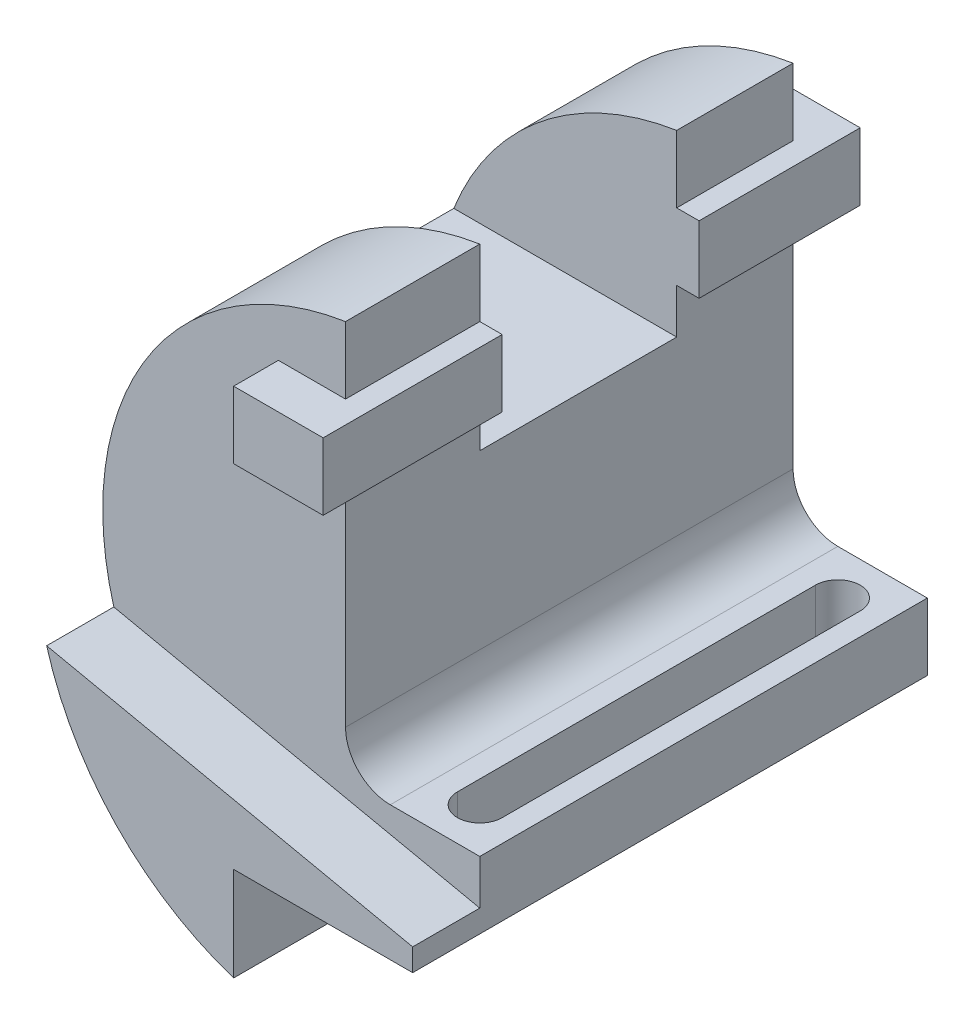
ISO-10303-21;
HEADER;
FILE_DESCRIPTION(('STEP AP214'),'2;1');
FILE_NAME('part.step','',(''),(''),'','','');
FILE_SCHEMA(('AUTOMOTIVE_DESIGN { 1 0 10303 214 1 1 1 1 }'));
ENDSEC;
DATA;
#1=APPLICATION_CONTEXT('core data for automotive mechanical design processes');
#2=APPLICATION_PROTOCOL_DEFINITION('international standard','automotive_design',2000,#1);
#3=PRODUCT_CONTEXT('',#1,'mechanical');
#4=PRODUCT('Part','Part','',(#3));
#5=PRODUCT_RELATED_PRODUCT_CATEGORY('part','',(#4));
#6=PRODUCT_DEFINITION_FORMATION('','',#4);
#7=PRODUCT_DEFINITION_CONTEXT('part definition',#1,'design');
#8=PRODUCT_DEFINITION('design','',#6,#7);
#9=PRODUCT_DEFINITION_SHAPE('','',#8);
#10=(LENGTH_UNIT() NAMED_UNIT(*) SI_UNIT(.MILLI.,.METRE.));
#11=(NAMED_UNIT(*) PLANE_ANGLE_UNIT() SI_UNIT($,.RADIAN.));
#12=(NAMED_UNIT(*) SI_UNIT($,.STERADIAN.) SOLID_ANGLE_UNIT());
#13=UNCERTAINTY_MEASURE_WITH_UNIT(LENGTH_MEASURE(1.E-05),#10,'distance_accuracy_value','');
#14=(GEOMETRIC_REPRESENTATION_CONTEXT(3) GLOBAL_UNCERTAINTY_ASSIGNED_CONTEXT((#13)) GLOBAL_UNIT_ASSIGNED_CONTEXT((#10,
#11,#12)) REPRESENTATION_CONTEXT('',''));
#15=CARTESIAN_POINT('',(0.,0.,0.));
#16=DIRECTION('',(0.,0.,1.));
#17=DIRECTION('',(1.,0.,0.));
#18=AXIS2_PLACEMENT_3D('',#15,#16,#17);
#19=CARTESIAN_POINT('',(-10.,63.4670189941201,115.));
#20=DIRECTION('',(-1.,0.,0.));
#21=DIRECTION('',(0.,-1.,0.));
#22=AXIS2_PLACEMENT_3D('',#19,#20,#21);
#23=PLANE('',#22);
#24=DIRECTION('',(0.,0.,-1.));
#25=VECTOR('',#24,1.);
#26=CARTESIAN_POINT('',(-10.,48.4670189941201,115.));
#27=LINE('',#26,#25);
#28=CARTESIAN_POINT('',(-10.,48.4670189941201,100.));
#29=VERTEX_POINT('',#28);
#30=CARTESIAN_POINT('',(-10.,48.4670189941201,70.));
#31=VERTEX_POINT('',#30);
#32=EDGE_CURVE('E334',#29,#31,#27,.T.);
#33=ORIENTED_EDGE('',*,*,#32,.T.);
#34=DIRECTION('',(0.,1.,0.));
#35=VECTOR('',#34,1.);
#36=CARTESIAN_POINT('',(-10.,63.4670189941201,70.));
#37=LINE('',#36,#35);
#38=CARTESIAN_POINT('',(-9.99999999999998,63.4670189941201,70.));
#39=VERTEX_POINT('',#38);
#40=EDGE_CURVE('E282',#31,#39,#37,.T.);
#41=ORIENTED_EDGE('',*,*,#40,.T.);
#42=DIRECTION('',(0.,0.,-1.));
#43=VECTOR('',#42,1.);
#44=CARTESIAN_POINT('',(-10.,63.4670189941201,115.));
#45=LINE('',#44,#43);
#46=CARTESIAN_POINT('',(-10.,63.4670189941201,100.));
#47=VERTEX_POINT('',#46);
#48=EDGE_CURVE('E393',#47,#39,#45,.T.);
#49=ORIENTED_EDGE('',*,*,#48,.F.);
#50=DIRECTION('',(0.,1.,0.));
#51=VECTOR('',#50,1.);
#52=CARTESIAN_POINT('',(-9.99999999999999,-15.0329810058799,100.));
#53=LINE('',#52,#51);
#54=EDGE_CURVE('E348',#29,#47,#53,.T.);
#55=ORIENTED_EDGE('',*,*,#54,.F.);
#56=EDGE_LOOP('',(#33,#41,#49,#55));
#57=FACE_BOUND('',#56,.T.);
#58=ADVANCED_FACE('F43',(#57),#23,.F.);
#59=CARTESIAN_POINT('',(-25.,48.4670189941201,-45.));
#60=DIRECTION('',(0.,1.,0.));
#61=DIRECTION('',(0.,0.,1.));
#62=AXIS2_PLACEMENT_3D('',#59,#60,#61);
#63=PLANE('',#62);
#64=DIRECTION('',(1.,0.,0.));
#65=VECTOR('',#64,1.);
#66=CARTESIAN_POINT('',(-25.,48.4670189941201,70.));
#67=LINE('',#66,#65);
#68=CARTESIAN_POINT('',(-5.,48.4670189941201,70.));
#69=VERTEX_POINT('',#68);
#70=EDGE_CURVE('E280',#31,#69,#67,.T.);
#71=ORIENTED_EDGE('',*,*,#70,.F.);
#72=ORIENTED_EDGE('',*,*,#32,.F.);
#73=DIRECTION('',(-1.,0.,0.));
#74=VECTOR('',#73,1.);
#75=CARTESIAN_POINT('',(0.,48.4670189941201,100.));
#76=LINE('',#75,#74);
#77=CARTESIAN_POINT('',(-25.,48.4670189941201,100.));
#78=VERTEX_POINT('',#77);
#79=EDGE_CURVE('E417',#29,#78,#76,.T.);
#80=ORIENTED_EDGE('',*,*,#79,.T.);
#81=DIRECTION('',(0.,0.,1.));
#82=VECTOR('',#81,1.);
#83=CARTESIAN_POINT('',(-25.,48.4670189941201,-45.));
#84=LINE('',#83,#82);
#85=CARTESIAN_POINT('',(-25.,48.4670189941201,110.));
#86=VERTEX_POINT('',#85);
#87=EDGE_CURVE('E314',#78,#86,#84,.T.);
#88=ORIENTED_EDGE('',*,*,#87,.T.);
#89=DIRECTION('',(-1.,0.,0.));
#90=VECTOR('',#89,1.);
#91=CARTESIAN_POINT('',(-25.,48.4670189941201,110.));
#92=LINE('',#91,#90);
#93=CARTESIAN_POINT('',(-4.99999999999999,48.4670189941201,110.));
#94=VERTEX_POINT('',#93);
#95=EDGE_CURVE('E308',#94,#86,#92,.T.);
#96=ORIENTED_EDGE('',*,*,#95,.F.);
#97=DIRECTION('',(0.,0.,1.));
#98=VECTOR('',#97,1.);
#99=CARTESIAN_POINT('',(-4.99999999999999,48.4670189941201,-45.));
#100=LINE('',#99,#98);
#101=EDGE_CURVE('E318',#69,#94,#100,.T.);
#102=ORIENTED_EDGE('',*,*,#101,.F.);
#103=EDGE_LOOP('',(#71,#72,#80,#88,#96,#102));
#104=FACE_BOUND('',#103,.T.);
#105=ADVANCED_FACE('F450',(#104),#63,.T.);
#106=CARTESIAN_POINT('',(-25.,33.4670189941201,-45.));
#107=DIRECTION('',(0.,-1.,0.));
#108=DIRECTION('',(0.,0.,-1.));
#109=AXIS2_PLACEMENT_3D('',#106,#107,#108);
#110=PLANE('',#109);
#111=DIRECTION('',(-1.,0.,0.));
#112=VECTOR('',#111,1.);
#113=CARTESIAN_POINT('',(-25.,33.4670189941201,70.));
#114=LINE('',#113,#112);
#115=CARTESIAN_POINT('',(-5.,33.4670189941201,70.));
#116=VERTEX_POINT('',#115);
#117=CARTESIAN_POINT('',(-10.,33.4670189941201,70.));
#118=VERTEX_POINT('',#117);
#119=EDGE_CURVE('E275',#116,#118,#114,.T.);
#120=ORIENTED_EDGE('',*,*,#119,.F.);
#121=DIRECTION('',(0.,0.,1.));
#122=VECTOR('',#121,1.);
#123=CARTESIAN_POINT('',(-4.99999999999999,33.4670189941201,-45.));
#124=LINE('',#123,#122);
#125=CARTESIAN_POINT('',(-4.99999999999999,33.4670189941201,110.));
#126=VERTEX_POINT('',#125);
#127=EDGE_CURVE('E322',#116,#126,#124,.T.);
#128=ORIENTED_EDGE('',*,*,#127,.T.);
#129=DIRECTION('',(1.,0.,0.));
#130=VECTOR('',#129,1.);
#131=CARTESIAN_POINT('',(-25.,33.4670189941201,110.));
#132=LINE('',#131,#130);
#133=CARTESIAN_POINT('',(-25.,33.4670189941201,110.));
#134=VERTEX_POINT('',#133);
#135=EDGE_CURVE('E302',#134,#126,#132,.T.);
#136=ORIENTED_EDGE('',*,*,#135,.F.);
#137=DIRECTION('',(0.,0.,1.));
#138=VECTOR('',#137,1.);
#139=CARTESIAN_POINT('',(-25.,33.4670189941201,-45.));
#140=LINE('',#139,#138);
#141=CARTESIAN_POINT('',(-25.,33.4670189941201,100.));
#142=VERTEX_POINT('',#141);
#143=EDGE_CURVE('E311',#142,#134,#140,.T.);
#144=ORIENTED_EDGE('',*,*,#143,.F.);
#145=DIRECTION('',(1.,0.,0.));
#146=VECTOR('',#145,1.);
#147=CARTESIAN_POINT('',(0.,33.4670189941201,100.));
#148=LINE('',#147,#146);
#149=CARTESIAN_POINT('',(-10.,33.4670189941201,100.));
#150=VERTEX_POINT('',#149);
#151=EDGE_CURVE('E411',#142,#150,#148,.T.);
#152=ORIENTED_EDGE('',*,*,#151,.T.);
#153=DIRECTION('',(0.,0.,1.));
#154=VECTOR('',#153,1.);
#155=CARTESIAN_POINT('',(-10.,33.4670189941201,115.));
#156=LINE('',#155,#154);
#157=EDGE_CURVE('E327',#118,#150,#156,.T.);
#158=ORIENTED_EDGE('',*,*,#157,.F.);
#159=EDGE_LOOP('',(#120,#128,#136,#144,#152,#158));
#160=FACE_BOUND('',#159,.T.);
#161=ADVANCED_FACE('F458',(#160),#110,.T.);
#162=CARTESIAN_POINT('',(-4.99999999999999,48.4670189941201,-45.));
#163=DIRECTION('',(1.,0.,0.));
#164=DIRECTION('',(0.,1.,0.));
#165=AXIS2_PLACEMENT_3D('',#162,#163,#164);
#166=PLANE('',#165);
#167=DIRECTION('',(0.,-1.,0.));
#168=VECTOR('',#167,1.);
#169=CARTESIAN_POINT('',(-4.99999999999999,48.4670189941201,70.));
#170=LINE('',#169,#168);
#171=EDGE_CURVE('E422',#69,#116,#170,.T.);
#172=ORIENTED_EDGE('',*,*,#171,.F.);
#173=ORIENTED_EDGE('',*,*,#101,.T.);
#174=DIRECTION('',(0.,1.,0.));
#175=VECTOR('',#174,1.);
#176=CARTESIAN_POINT('',(-4.99999999999999,48.4670189941201,110.));
#177=LINE('',#176,#175);
#178=EDGE_CURVE('E305',#126,#94,#177,.T.);
#179=ORIENTED_EDGE('',*,*,#178,.F.);
#180=ORIENTED_EDGE('',*,*,#127,.F.);
#181=EDGE_LOOP('',(#172,#173,#179,#180));
#182=FACE_BOUND('',#181,.T.);
#183=ADVANCED_FACE('F465',(#182),#166,.T.);
#184=CARTESIAN_POINT('',(-9.99999999999998,63.4670189941201,26.));
#185=VERTEX_POINT('',#184);
#186=CARTESIAN_POINT('',(-10.,63.4670189941201,0.));
#187=VERTEX_POINT('',#186);
#188=EDGE_CURVE('E374',#185,#187,#45,.T.);
#189=ORIENTED_EDGE('',*,*,#188,.F.);
#190=DIRECTION('',(0.,-1.,0.));
#191=VECTOR('',#190,1.);
#192=CARTESIAN_POINT('',(-10.,63.4670189941201,26.));
#193=LINE('',#192,#191);
#194=CARTESIAN_POINT('',(-10.,48.4670189941201,26.));
#195=VERTEX_POINT('',#194);
#196=EDGE_CURVE('E269',#185,#195,#193,.T.);
#197=ORIENTED_EDGE('',*,*,#196,.T.);
#198=CARTESIAN_POINT('',(-10.,48.4670189941201,0.));
#199=VERTEX_POINT('',#198);
#200=EDGE_CURVE('E333',#195,#199,#27,.T.);
#201=ORIENTED_EDGE('',*,*,#200,.T.);
#202=DIRECTION('',(0.,1.,0.));
#203=VECTOR('',#202,1.);
#204=CARTESIAN_POINT('',(-10.,63.4670189941201,0.));
#205=LINE('',#204,#203);
#206=EDGE_CURVE('E390',#199,#187,#205,.T.);
#207=ORIENTED_EDGE('',*,*,#206,.T.);
#208=EDGE_LOOP('',(#189,#197,#201,#207));
#209=FACE_BOUND('',#208,.T.);
#210=ADVANCED_FACE('F453',(#209),#23,.F.);
#211=CARTESIAN_POINT('',(0.,-25.0329810058799,115.));
#212=DIRECTION('',(0.,-1.,0.));
#213=DIRECTION('',(0.,0.,-1.));
#214=AXIS2_PLACEMENT_3D('',#211,#212,#213);
#215=PLANE('',#214);
#216=DIRECTION('',(0.,0.,1.));
#217=VECTOR('',#216,1.);
#218=CARTESIAN_POINT('',(5.00000000000004,-25.0329810058799,10.));
#219=LINE('',#218,#217);
#220=CARTESIAN_POINT('',(5.00000000000004,-25.0329810058799,10.));
#221=VERTEX_POINT('',#220);
#222=CARTESIAN_POINT('',(5.00000000000005,-25.0329810058799,90.));
#223=VERTEX_POINT('',#222);
#224=EDGE_CURVE('E240',#221,#223,#219,.T.);
#225=ORIENTED_EDGE('',*,*,#224,.F.);
#226=CARTESIAN_POINT('',(10.,-25.0329810058799,10.));
#227=DIRECTION('',(0.,1.,0.));
#228=DIRECTION('',(0.,0.,1.));
#229=AXIS2_PLACEMENT_3D('',#226,#227,#228);
#230=CIRCLE('',#229,5.);
#231=CARTESIAN_POINT('',(15.,-25.0329810058799,10.));
#232=VERTEX_POINT('',#231);
#233=EDGE_CURVE('E58',#232,#221,#230,.T.);
#234=ORIENTED_EDGE('',*,*,#233,.F.);
#235=DIRECTION('',(0.,0.,-1.));
#236=VECTOR('',#235,1.);
#237=CARTESIAN_POINT('',(15.,-25.0329810058799,10.));
#238=LINE('',#237,#236);
#239=CARTESIAN_POINT('',(15.,-25.0329810058799,90.));
#240=VERTEX_POINT('',#239);
#241=EDGE_CURVE('E247',#240,#232,#238,.T.);
#242=ORIENTED_EDGE('',*,*,#241,.F.);
#243=CARTESIAN_POINT('',(10.,-25.0329810058799,90.));
#244=DIRECTION('',(0.,1.,0.));
#245=DIRECTION('',(0.,0.,1.));
#246=AXIS2_PLACEMENT_3D('',#243,#244,#245);
#247=CIRCLE('',#246,4.99999999999999);
#248=EDGE_CURVE('E231',#223,#240,#247,.T.);
#249=ORIENTED_EDGE('',*,*,#248,.F.);
#250=EDGE_LOOP('',(#225,#234,#242,#249));
#251=FACE_BOUND('',#250,.T.);
#252=DIRECTION('',(-1.,0.,0.));
#253=VECTOR('',#252,1.);
#254=CARTESIAN_POINT('',(20.,-25.0329810058799,100.));
#255=LINE('',#254,#253);
#256=CARTESIAN_POINT('',(20.,-25.0329810058799,100.));
#257=VERTEX_POINT('',#256);
#258=CARTESIAN_POINT('',(0.,-25.0329810058799,100.));
#259=VERTEX_POINT('',#258);
#260=EDGE_CURVE('E344',#257,#259,#255,.T.);
#261=ORIENTED_EDGE('',*,*,#260,.F.);
#262=DIRECTION('',(0.,0.,-1.));
#263=VECTOR('',#262,1.);
#264=CARTESIAN_POINT('',(20.,-25.0329810058799,115.));
#265=LINE('',#264,#263);
#266=CARTESIAN_POINT('',(20.,-25.0329810058799,0.));
#267=VERTEX_POINT('',#266);
#268=EDGE_CURVE('E400',#257,#267,#265,.T.);
#269=ORIENTED_EDGE('',*,*,#268,.T.);
#270=DIRECTION('',(-1.,0.,0.));
#271=VECTOR('',#270,1.);
#272=CARTESIAN_POINT('',(0.,-25.0329810058799,0.));
#273=LINE('',#272,#271);
#274=CARTESIAN_POINT('',(0.,-25.0329810058799,0.));
#275=VERTEX_POINT('',#274);
#276=EDGE_CURVE('E384',#267,#275,#273,.T.);
#277=ORIENTED_EDGE('',*,*,#276,.T.);
#278=DIRECTION('',(0.,0.,-1.));
#279=VECTOR('',#278,1.);
#280=CARTESIAN_POINT('',(0.,-25.0329810058799,115.));
#281=LINE('',#280,#279);
#282=EDGE_CURVE('E398',#259,#275,#281,.T.);
#283=ORIENTED_EDGE('',*,*,#282,.F.);
#284=EDGE_LOOP('',(#261,#269,#277,#283));
#285=FACE_BOUND('',#284,.T.);
#286=ADVANCED_FACE('F244',(#251,#285),#215,.F.);
#287=CARTESIAN_POINT('',(0.,-15.0329810058799,115.));
#288=DIRECTION('',(0.,0.,-1.));
#289=DIRECTION('',(-1.,0.,0.));
#290=AXIS2_PLACEMENT_3D('',#287,#288,#289);
#291=CYLINDRICAL_SURFACE('',#290,10.);
#292=CARTESIAN_POINT('',(0.,-15.0329810058799,100.));
#293=DIRECTION('',(0.,0.,-1.));
#294=DIRECTION('',(1.,0.,0.));
#295=AXIS2_PLACEMENT_3D('',#292,#293,#294);
#296=CIRCLE('',#295,10.);
#297=CARTESIAN_POINT('',(-9.99999999999999,-15.0329810058799,100.));
#298=VERTEX_POINT('',#297);
#299=EDGE_CURVE('E346',#259,#298,#296,.T.);
#300=ORIENTED_EDGE('',*,*,#299,.F.);
#301=ORIENTED_EDGE('',*,*,#282,.T.);
#302=CARTESIAN_POINT('',(0.,-15.0329810058799,0.));
#303=DIRECTION('',(0.,0.,-1.));
#304=DIRECTION('',(1.,0.,0.));
#305=AXIS2_PLACEMENT_3D('',#302,#303,#304);
#306=CIRCLE('',#305,10.);
#307=CARTESIAN_POINT('',(-9.99999999999999,-15.0329810058799,0.));
#308=VERTEX_POINT('',#307);
#309=EDGE_CURVE('E387',#275,#308,#306,.T.);
#310=ORIENTED_EDGE('',*,*,#309,.T.);
#311=DIRECTION('',(0.,0.,-1.));
#312=VECTOR('',#311,1.);
#313=CARTESIAN_POINT('',(-9.99999999999999,-15.0329810058799,115.));
#314=LINE('',#313,#312);
#315=EDGE_CURVE('E396',#298,#308,#314,.T.);
#316=ORIENTED_EDGE('',*,*,#315,.F.);
#317=EDGE_LOOP('',(#300,#301,#310,#316));
#318=FACE_BOUND('',#317,.T.);
#319=ADVANCED_FACE('F468',(#318),#291,.F.);
#320=DIRECTION('',(0.,0.,1.));
#321=VECTOR('',#320,1.);
#322=CARTESIAN_POINT('',(-9.99999999999999,23.4670189941201,115.));
#323=LINE('',#322,#321);
#324=CARTESIAN_POINT('',(-9.99999999999999,23.4670189941201,26.));
#325=VERTEX_POINT('',#324);
#326=CARTESIAN_POINT('',(-9.99999999999999,23.4670189941201,70.));
#327=VERTEX_POINT('',#326);
#328=EDGE_CURVE('E288',#325,#327,#323,.T.);
#329=ORIENTED_EDGE('',*,*,#328,.T.);
#330=DIRECTION('',(0.,1.,0.));
#331=VECTOR('',#330,1.);
#332=CARTESIAN_POINT('',(-10.,63.4670189941201,70.));
#333=LINE('',#332,#331);
#334=EDGE_CURVE('E277',#327,#118,#333,.T.);
#335=ORIENTED_EDGE('',*,*,#334,.T.);
#336=ORIENTED_EDGE('',*,*,#157,.T.);
#337=EDGE_CURVE('E349',#298,#150,#53,.T.);
#338=ORIENTED_EDGE('',*,*,#337,.F.);
#339=ORIENTED_EDGE('',*,*,#315,.T.);
#340=CARTESIAN_POINT('',(-10.,33.4670189941201,0.));
#341=VERTEX_POINT('',#340);
#342=EDGE_CURVE('E367',#308,#341,#205,.T.);
#343=ORIENTED_EDGE('',*,*,#342,.T.);
#344=CARTESIAN_POINT('',(-10.,33.4670189941201,26.));
#345=VERTEX_POINT('',#344);
#346=EDGE_CURVE('E328',#341,#345,#156,.T.);
#347=ORIENTED_EDGE('',*,*,#346,.T.);
#348=DIRECTION('',(0.,-1.,0.));
#349=VECTOR('',#348,1.);
#350=CARTESIAN_POINT('',(-10.,63.4670189941201,26.));
#351=LINE('',#350,#349);
#352=EDGE_CURVE('E264',#345,#325,#351,.T.);
#353=ORIENTED_EDGE('',*,*,#352,.T.);
#354=EDGE_LOOP('',(#329,#335,#336,#338,#339,#343,#347,#353));
#355=FACE_BOUND('',#354,.T.);
#356=ADVANCED_FACE('F454',(#355),#23,.F.);
#357=CARTESIAN_POINT('',(0.,0.,115.));
#358=DIRECTION('',(0.,0.,-1.));
#359=DIRECTION('',(-1.,0.,0.));
#360=AXIS2_PLACEMENT_3D('',#357,#358,#359);
#361=CYLINDRICAL_SURFACE('',#360,64.25);
#362=ORIENTED_EDGE('',*,*,#48,.T.);
#363=CARTESIAN_POINT('',(0.,0.,70.));
#364=DIRECTION('',(0.,0.,1.));
#365=DIRECTION('',(0.,-1.,0.));
#366=AXIS2_PLACEMENT_3D('',#363,#364,#365);
#367=CIRCLE('',#366,64.25);
#368=CARTESIAN_POINT('',(-59.8110484737528,23.4670189941201,70.));
#369=VERTEX_POINT('',#368);
#370=EDGE_CURVE('E285',#39,#369,#367,.T.);
#371=ORIENTED_EDGE('',*,*,#370,.T.);
#372=DIRECTION('',(0.,0.,-1.));
#373=VECTOR('',#372,1.);
#374=CARTESIAN_POINT('',(-59.8110484737528,23.4670189941201,115.));
#375=LINE('',#374,#373);
#376=CARTESIAN_POINT('',(-59.8110484737528,23.4670189941201,26.));
#377=VERTEX_POINT('',#376);
#378=EDGE_CURVE('E424',#369,#377,#375,.T.);
#379=ORIENTED_EDGE('',*,*,#378,.T.);
#380=CARTESIAN_POINT('',(0.,0.,26.));
#381=DIRECTION('',(0.,0.,-1.));
#382=DIRECTION('',(0.,1.,0.));
#383=AXIS2_PLACEMENT_3D('',#380,#381,#382);
#384=CIRCLE('',#383,64.25);
#385=EDGE_CURVE('E272',#377,#185,#384,.T.);
#386=ORIENTED_EDGE('',*,*,#385,.T.);
#387=ORIENTED_EDGE('',*,*,#188,.T.);
#388=CARTESIAN_POINT('',(0.,0.,0.));
#389=DIRECTION('',(0.,0.,1.));
#390=DIRECTION('',(1.,0.,0.));
#391=AXIS2_PLACEMENT_3D('',#388,#389,#390);
#392=CIRCLE('',#391,64.25);
#393=CARTESIAN_POINT('',(-20.,-61.0578619016421,0.));
#394=VERTEX_POINT('',#393);
#395=EDGE_CURVE('E362',#187,#394,#392,.T.);
#396=ORIENTED_EDGE('',*,*,#395,.T.);
#397=DIRECTION('',(0.,0.,-1.));
#398=VECTOR('',#397,1.);
#399=CARTESIAN_POINT('',(-20.,-61.0578619016421,115.));
#400=LINE('',#399,#398);
#401=CARTESIAN_POINT('',(-20.,-61.0578619016421,115.));
#402=VERTEX_POINT('',#401);
#403=EDGE_CURVE('E408',#402,#394,#400,.T.);
#404=ORIENTED_EDGE('',*,*,#403,.F.);
#405=CARTESIAN_POINT('',(0.,0.,115.));
#406=DIRECTION('',(0.,0.,1.));
#407=DIRECTION('',(1.,0.,0.));
#408=AXIS2_PLACEMENT_3D('',#405,#406,#407);
#409=CIRCLE('',#408,64.25);
#410=CARTESIAN_POINT('',(-61.7779999040939,-17.6505305260146,115.));
#411=VERTEX_POINT('',#410);
#412=EDGE_CURVE('E364',#411,#402,#409,.T.);
#413=ORIENTED_EDGE('',*,*,#412,.F.);
#414=DIRECTION('',(0.,0.,1.));
#415=VECTOR('',#414,1.);
#416=CARTESIAN_POINT('',(-61.7779999040939,-17.6505305260146,100.));
#417=LINE('',#416,#415);
#418=CARTESIAN_POINT('',(-61.7779999040939,-17.6505305260146,100.));
#419=VERTEX_POINT('',#418);
#420=EDGE_CURVE('E357',#419,#411,#417,.T.);
#421=ORIENTED_EDGE('',*,*,#420,.F.);
#422=CARTESIAN_POINT('',(0.,0.,100.));
#423=DIRECTION('',(0.,0.,1.));
#424=DIRECTION('',(1.,0.,0.));
#425=AXIS2_PLACEMENT_3D('',#422,#423,#424);
#426=CIRCLE('',#425,64.25);
#427=EDGE_CURVE('E352',#47,#419,#426,.T.);
#428=ORIENTED_EDGE('',*,*,#427,.F.);
#429=EDGE_LOOP('',(#362,#371,#379,#386,#387,#396,#404,#413,#421,#428));
#430=FACE_BOUND('',#429,.T.);
#431=ADVANCED_FACE('F45',(#430),#361,.T.);
#432=CARTESIAN_POINT('',(-20.,-40.0329810058799,115.));
#433=DIRECTION('',(-1.,0.,0.));
#434=DIRECTION('',(0.,0.,1.));
#435=AXIS2_PLACEMENT_3D('',#432,#433,#434);
#436=PLANE('',#435);
#437=DIRECTION('',(0.,1.,0.));
#438=VECTOR('',#437,1.);
#439=CARTESIAN_POINT('',(-20.,-40.0329810058799,0.));
#440=LINE('',#439,#438);
#441=CARTESIAN_POINT('',(-20.,-40.0329810058799,0.));
#442=VERTEX_POINT('',#441);
#443=EDGE_CURVE('E377',#394,#442,#440,.T.);
#444=ORIENTED_EDGE('',*,*,#443,.T.);
#445=DIRECTION('',(0.,0.,-1.));
#446=VECTOR('',#445,1.);
#447=CARTESIAN_POINT('',(-20.,-40.0329810058799,115.));
#448=LINE('',#447,#446);
#449=CARTESIAN_POINT('',(-20.,-40.0329810058799,115.));
#450=VERTEX_POINT('',#449);
#451=EDGE_CURVE('E405',#450,#442,#448,.T.);
#452=ORIENTED_EDGE('',*,*,#451,.F.);
#453=DIRECTION('',(0.,1.,0.));
#454=VECTOR('',#453,1.);
#455=CARTESIAN_POINT('',(-20.,-40.0329810058799,115.));
#456=LINE('',#455,#454);
#457=EDGE_CURVE('E366',#402,#450,#456,.T.);
#458=ORIENTED_EDGE('',*,*,#457,.F.);
#459=ORIENTED_EDGE('',*,*,#403,.T.);
#460=EDGE_LOOP('',(#444,#452,#458,#459));
#461=FACE_BOUND('',#460,.T.);
#462=ADVANCED_FACE('F474',(#461),#436,.F.);
#463=CARTESIAN_POINT('',(20.,-40.0329810058799,115.));
#464=DIRECTION('',(0.,1.,0.));
#465=DIRECTION('',(0.,0.,1.));
#466=AXIS2_PLACEMENT_3D('',#463,#464,#465);
#467=PLANE('',#466);
#468=DIRECTION('',(0.,0.,-1.));
#469=VECTOR('',#468,1.);
#470=CARTESIAN_POINT('',(15.,-40.0329810058799,115.));
#471=LINE('',#470,#469);
#472=CARTESIAN_POINT('',(15.,-40.0329810058799,90.));
#473=VERTEX_POINT('',#472);
#474=CARTESIAN_POINT('',(15.,-40.0329810058799,10.));
#475=VERTEX_POINT('',#474);
#476=EDGE_CURVE('E51',#473,#475,#471,.T.);
#477=ORIENTED_EDGE('',*,*,#476,.T.);
#478=CARTESIAN_POINT('',(10.,-40.0329810058799,10.));
#479=DIRECTION('',(0.,1.,0.));
#480=DIRECTION('',(0.,0.,1.));
#481=AXIS2_PLACEMENT_3D('',#478,#479,#480);
#482=CIRCLE('',#481,5.);
#483=CARTESIAN_POINT('',(5.00000000000004,-40.0329810058799,10.));
#484=VERTEX_POINT('',#483);
#485=EDGE_CURVE('E12',#475,#484,#482,.T.);
#486=ORIENTED_EDGE('',*,*,#485,.T.);
#487=DIRECTION('',(0.,0.,1.));
#488=VECTOR('',#487,1.);
#489=CARTESIAN_POINT('',(5.00000000000005,-40.0329810058799,115.));
#490=LINE('',#489,#488);
#491=CARTESIAN_POINT('',(5.00000000000005,-40.0329810058799,90.));
#492=VERTEX_POINT('',#491);
#493=EDGE_CURVE('E427',#484,#492,#490,.T.);
#494=ORIENTED_EDGE('',*,*,#493,.T.);
#495=CARTESIAN_POINT('',(10.,-40.0329810058799,90.));
#496=DIRECTION('',(0.,1.,0.));
#497=DIRECTION('',(0.,0.,1.));
#498=AXIS2_PLACEMENT_3D('',#495,#496,#497);
#499=CIRCLE('',#498,4.99999999999999);
#500=EDGE_CURVE('E234',#492,#473,#499,.T.);
#501=ORIENTED_EDGE('',*,*,#500,.T.);
#502=EDGE_LOOP('',(#477,#486,#494,#501));
#503=FACE_BOUND('',#502,.T.);
#504=DIRECTION('',(1.,0.,0.));
#505=VECTOR('',#504,1.);
#506=CARTESIAN_POINT('',(20.,-40.0329810058799,0.));
#507=LINE('',#506,#505);
#508=CARTESIAN_POINT('',(20.,-40.0329810058799,0.));
#509=VERTEX_POINT('',#508);
#510=EDGE_CURVE('E379',#442,#509,#507,.T.);
#511=ORIENTED_EDGE('',*,*,#510,.T.);
#512=DIRECTION('',(0.,0.,-1.));
#513=VECTOR('',#512,1.);
#514=CARTESIAN_POINT('',(20.,-40.0329810058799,115.));
#515=LINE('',#514,#513);
#516=CARTESIAN_POINT('',(20.,-40.0329810058799,115.));
#517=VERTEX_POINT('',#516);
#518=EDGE_CURVE('E402',#517,#509,#515,.T.);
#519=ORIENTED_EDGE('',*,*,#518,.F.);
#520=DIRECTION('',(1.,0.,0.));
#521=VECTOR('',#520,1.);
#522=CARTESIAN_POINT('',(20.,-40.0329810058799,115.));
#523=LINE('',#522,#521);
#524=EDGE_CURVE('E369',#450,#517,#523,.T.);
#525=ORIENTED_EDGE('',*,*,#524,.F.);
#526=ORIENTED_EDGE('',*,*,#451,.T.);
#527=EDGE_LOOP('',(#511,#519,#525,#526));
#528=FACE_BOUND('',#527,.T.);
#529=ADVANCED_FACE('F431',(#503,#528),#467,.F.);
#530=CARTESIAN_POINT('',(20.,-25.0329810058799,115.));
#531=DIRECTION('',(-1.,0.,0.));
#532=DIRECTION('',(0.,-1.,0.));
#533=AXIS2_PLACEMENT_3D('',#530,#531,#532);
#534=PLANE('',#533);
#535=DIRECTION('',(0.,1.,0.));
#536=VECTOR('',#535,1.);
#537=CARTESIAN_POINT('',(20.,-35.0329810058799,100.));
#538=LINE('',#537,#536);
#539=CARTESIAN_POINT('',(20.,-35.0329810058799,100.));
#540=VERTEX_POINT('',#539);
#541=EDGE_CURVE('E342',#540,#257,#538,.T.);
#542=ORIENTED_EDGE('',*,*,#541,.F.);
#543=DIRECTION('',(0.,0.,1.));
#544=VECTOR('',#543,1.);
#545=CARTESIAN_POINT('',(20.,-35.0329810058799,100.));
#546=LINE('',#545,#544);
#547=CARTESIAN_POINT('',(20.,-35.0329810058799,115.));
#548=VERTEX_POINT('',#547);
#549=EDGE_CURVE('E359',#540,#548,#546,.T.);
#550=ORIENTED_EDGE('',*,*,#549,.T.);
#551=DIRECTION('',(0.,1.,0.));
#552=VECTOR('',#551,1.);
#553=CARTESIAN_POINT('',(20.,-25.0329810058799,115.));
#554=LINE('',#553,#552);
#555=EDGE_CURVE('E371',#517,#548,#554,.T.);
#556=ORIENTED_EDGE('',*,*,#555,.F.);
#557=ORIENTED_EDGE('',*,*,#518,.T.);
#558=DIRECTION('',(0.,1.,0.));
#559=VECTOR('',#558,1.);
#560=CARTESIAN_POINT('',(20.,-25.0329810058799,0.));
#561=LINE('',#560,#559);
#562=EDGE_CURVE('E381',#509,#267,#561,.T.);
#563=ORIENTED_EDGE('',*,*,#562,.T.);
#564=ORIENTED_EDGE('',*,*,#268,.F.);
#565=EDGE_LOOP('',(#542,#550,#556,#557,#563,#564));
#566=FACE_BOUND('',#565,.T.);
#567=ADVANCED_FACE('F509',(#566),#534,.F.);
#568=CARTESIAN_POINT('',(0.,0.,115.));
#569=DIRECTION('',(0.,0.,1.));
#570=DIRECTION('',(1.,0.,0.));
#571=AXIS2_PLACEMENT_3D('',#568,#569,#570);
#572=PLANE('',#571);
#573=DIRECTION('',(0.978147600733806,-0.207911690817756,0.));
#574=VECTOR('',#573,1.);
#575=CARTESIAN_POINT('',(20.,-35.0329810058799,115.));
#576=LINE('',#575,#574);
#577=EDGE_CURVE('E341',#411,#548,#576,.T.);
#578=ORIENTED_EDGE('',*,*,#577,.F.);
#579=ORIENTED_EDGE('',*,*,#412,.T.);
#580=ORIENTED_EDGE('',*,*,#457,.T.);
#581=ORIENTED_EDGE('',*,*,#524,.T.);
#582=ORIENTED_EDGE('',*,*,#555,.T.);
#583=EDGE_LOOP('',(#578,#579,#580,#581,#582));
#584=FACE_BOUND('',#583,.T.);
#585=ADVANCED_FACE('F501',(#584),#572,.T.);
#586=CARTESIAN_POINT('',(0.,0.,0.));
#587=DIRECTION('',(0.,0.,1.));
#588=DIRECTION('',(1.,0.,0.));
#589=AXIS2_PLACEMENT_3D('',#586,#587,#588);
#590=PLANE('',#589);
#591=ORIENTED_EDGE('',*,*,#206,.F.);
#592=DIRECTION('',(-1.,0.,0.));
#593=VECTOR('',#592,1.);
#594=CARTESIAN_POINT('',(0.,48.4670189941201,0.));
#595=LINE('',#594,#593);
#596=CARTESIAN_POINT('',(-25.,48.4670189941201,0.));
#597=VERTEX_POINT('',#596);
#598=EDGE_CURVE('E337',#199,#597,#595,.T.);
#599=ORIENTED_EDGE('',*,*,#598,.T.);
#600=DIRECTION('',(0.,-1.,0.));
#601=VECTOR('',#600,1.);
#602=CARTESIAN_POINT('',(-25.,0.,0.));
#603=LINE('',#602,#601);
#604=CARTESIAN_POINT('',(-25.,33.4670189941201,0.));
#605=VERTEX_POINT('',#604);
#606=EDGE_CURVE('E339',#597,#605,#603,.T.);
#607=ORIENTED_EDGE('',*,*,#606,.T.);
#608=DIRECTION('',(1.,0.,0.));
#609=VECTOR('',#608,1.);
#610=CARTESIAN_POINT('',(0.,33.4670189941201,0.));
#611=LINE('',#610,#609);
#612=EDGE_CURVE('E331',#605,#341,#611,.T.);
#613=ORIENTED_EDGE('',*,*,#612,.T.);
#614=ORIENTED_EDGE('',*,*,#342,.F.);
#615=ORIENTED_EDGE('',*,*,#309,.F.);
#616=ORIENTED_EDGE('',*,*,#276,.F.);
#617=ORIENTED_EDGE('',*,*,#562,.F.);
#618=ORIENTED_EDGE('',*,*,#510,.F.);
#619=ORIENTED_EDGE('',*,*,#443,.F.);
#620=ORIENTED_EDGE('',*,*,#395,.F.);
#621=EDGE_LOOP('',(#591,#599,#607,#613,#614,#615,#616,#617,#618,#619,#620));
#622=FACE_BOUND('',#621,.T.);
#623=ADVANCED_FACE('F490',(#622),#590,.F.);
#624=CARTESIAN_POINT('',(20.,-35.0329810058799,100.));
#625=DIRECTION('',(-0.207911690817756,-0.978147600733806,0.));
#626=DIRECTION('',(0.978147600733806,-0.207911690817756,0.));
#627=AXIS2_PLACEMENT_3D('',#624,#625,#626);
#628=PLANE('',#627);
#629=ORIENTED_EDGE('',*,*,#577,.T.);
#630=ORIENTED_EDGE('',*,*,#549,.F.);
#631=DIRECTION('',(0.978147600733806,-0.207911690817756,0.));
#632=VECTOR('',#631,1.);
#633=CARTESIAN_POINT('',(20.,-35.0329810058799,100.));
#634=LINE('',#633,#632);
#635=EDGE_CURVE('E354',#419,#540,#634,.T.);
#636=ORIENTED_EDGE('',*,*,#635,.F.);
#637=ORIENTED_EDGE('',*,*,#420,.T.);
#638=EDGE_LOOP('',(#629,#630,#636,#637));
#639=FACE_BOUND('',#638,.T.);
#640=ADVANCED_FACE('F505',(#639),#628,.F.);
#641=CARTESIAN_POINT('',(0.,-15.0329810058799,100.));
#642=DIRECTION('',(0.,0.,1.));
#643=DIRECTION('',(1.,0.,0.));
#644=AXIS2_PLACEMENT_3D('',#641,#642,#643);
#645=PLANE('',#644);
#646=ORIENTED_EDGE('',*,*,#79,.F.);
#647=ORIENTED_EDGE('',*,*,#54,.T.);
#648=ORIENTED_EDGE('',*,*,#427,.T.);
#649=ORIENTED_EDGE('',*,*,#635,.T.);
#650=ORIENTED_EDGE('',*,*,#541,.T.);
#651=ORIENTED_EDGE('',*,*,#260,.T.);
#652=ORIENTED_EDGE('',*,*,#299,.T.);
#653=ORIENTED_EDGE('',*,*,#337,.T.);
#654=ORIENTED_EDGE('',*,*,#151,.F.);
#655=DIRECTION('',(0.,-1.,0.));
#656=VECTOR('',#655,1.);
#657=CARTESIAN_POINT('',(-25.,-15.0329810058799,100.));
#658=LINE('',#657,#656);
#659=EDGE_CURVE('E414',#78,#142,#658,.T.);
#660=ORIENTED_EDGE('',*,*,#659,.F.);
#661=EDGE_LOOP('',(#646,#647,#648,#649,#650,#651,#652,#653,#654,#660));
#662=FACE_BOUND('',#661,.T.);
#663=ADVANCED_FACE('F513',(#662),#645,.T.);
#664=CARTESIAN_POINT('',(-25.,48.4670189941201,-45.));
#665=DIRECTION('',(-1.,0.,0.));
#666=DIRECTION('',(0.,-1.,0.));
#667=AXIS2_PLACEMENT_3D('',#664,#665,#666);
#668=PLANE('',#667);
#669=ORIENTED_EDGE('',*,*,#606,.F.);
#670=CARTESIAN_POINT('',(-25.,48.4670189941201,-10.));
#671=VERTEX_POINT('',#670);
#672=EDGE_CURVE('E295',#671,#597,#84,.T.);
#673=ORIENTED_EDGE('',*,*,#672,.F.);
#674=DIRECTION('',(0.,1.,0.));
#675=VECTOR('',#674,1.);
#676=CARTESIAN_POINT('',(-25.,48.4670189941201,-10.));
#677=LINE('',#676,#675);
#678=CARTESIAN_POINT('',(-25.,33.4670189941201,-10.));
#679=VERTEX_POINT('',#678);
#680=EDGE_CURVE('E297',#679,#671,#677,.T.);
#681=ORIENTED_EDGE('',*,*,#680,.F.);
#682=EDGE_CURVE('E323',#679,#605,#140,.T.);
#683=ORIENTED_EDGE('',*,*,#682,.T.);
#684=EDGE_LOOP('',(#669,#673,#681,#683));
#685=FACE_BOUND('',#684,.T.);
#686=ADVANCED_FACE('F558',(#685),#668,.T.);
#687=DIRECTION('',(-1.,0.,0.));
#688=VECTOR('',#687,1.);
#689=CARTESIAN_POINT('',(-25.,48.4670189941201,26.));
#690=LINE('',#689,#688);
#691=CARTESIAN_POINT('',(-5.,48.4670189941201,26.));
#692=VERTEX_POINT('',#691);
#693=EDGE_CURVE('E267',#692,#195,#690,.T.);
#694=ORIENTED_EDGE('',*,*,#693,.F.);
#695=CARTESIAN_POINT('',(-4.99999999999999,48.4670189941201,-10.));
#696=VERTEX_POINT('',#695);
#697=EDGE_CURVE('E315',#696,#692,#100,.T.);
#698=ORIENTED_EDGE('',*,*,#697,.F.);
#699=DIRECTION('',(1.,0.,0.));
#700=VECTOR('',#699,1.);
#701=CARTESIAN_POINT('',(-25.,48.4670189941201,-10.));
#702=LINE('',#701,#700);
#703=EDGE_CURVE('E294',#671,#696,#702,.T.);
#704=ORIENTED_EDGE('',*,*,#703,.F.);
#705=ORIENTED_EDGE('',*,*,#672,.T.);
#706=ORIENTED_EDGE('',*,*,#598,.F.);
#707=ORIENTED_EDGE('',*,*,#200,.F.);
#708=EDGE_LOOP('',(#694,#698,#704,#705,#706,#707));
#709=FACE_BOUND('',#708,.T.);
#710=ADVANCED_FACE('F461',(#709),#63,.T.);
#711=DIRECTION('',(1.,0.,0.));
#712=VECTOR('',#711,1.);
#713=CARTESIAN_POINT('',(-25.,33.4670189941201,26.));
#714=LINE('',#713,#712);
#715=CARTESIAN_POINT('',(-4.99999999999999,33.4670189941201,26.));
#716=VERTEX_POINT('',#715);
#717=EDGE_CURVE('E260',#345,#716,#714,.T.);
#718=ORIENTED_EDGE('',*,*,#717,.F.);
#719=ORIENTED_EDGE('',*,*,#346,.F.);
#720=ORIENTED_EDGE('',*,*,#612,.F.);
#721=ORIENTED_EDGE('',*,*,#682,.F.);
#722=DIRECTION('',(-1.,0.,0.));
#723=VECTOR('',#722,1.);
#724=CARTESIAN_POINT('',(-25.,33.4670189941201,-10.));
#725=LINE('',#724,#723);
#726=CARTESIAN_POINT('',(-4.99999999999999,33.4670189941201,-10.));
#727=VERTEX_POINT('',#726);
#728=EDGE_CURVE('E299',#727,#679,#725,.T.);
#729=ORIENTED_EDGE('',*,*,#728,.F.);
#730=EDGE_CURVE('E319',#727,#716,#124,.T.);
#731=ORIENTED_EDGE('',*,*,#730,.T.);
#732=EDGE_LOOP('',(#718,#719,#720,#721,#729,#731));
#733=FACE_BOUND('',#732,.T.);
#734=ADVANCED_FACE('F557',(#733),#110,.T.);
#735=ORIENTED_EDGE('',*,*,#87,.F.);
#736=ORIENTED_EDGE('',*,*,#659,.T.);
#737=ORIENTED_EDGE('',*,*,#143,.T.);
#738=DIRECTION('',(0.,-1.,0.));
#739=VECTOR('',#738,1.);
#740=CARTESIAN_POINT('',(-25.,48.4670189941201,110.));
#741=LINE('',#740,#739);
#742=EDGE_CURVE('E291',#86,#134,#741,.T.);
#743=ORIENTED_EDGE('',*,*,#742,.F.);
#744=EDGE_LOOP('',(#735,#736,#737,#743));
#745=FACE_BOUND('',#744,.T.);
#746=ADVANCED_FACE('F528',(#745),#668,.T.);
#747=DIRECTION('',(0.,1.,0.));
#748=VECTOR('',#747,1.);
#749=CARTESIAN_POINT('',(-4.99999999999999,48.4670189941201,26.));
#750=LINE('',#749,#748);
#751=EDGE_CURVE('E420',#716,#692,#750,.T.);
#752=ORIENTED_EDGE('',*,*,#751,.F.);
#753=ORIENTED_EDGE('',*,*,#730,.F.);
#754=DIRECTION('',(0.,-1.,0.));
#755=VECTOR('',#754,1.);
#756=CARTESIAN_POINT('',(-4.99999999999999,48.4670189941201,-10.));
#757=LINE('',#756,#755);
#758=EDGE_CURVE('E292',#696,#727,#757,.T.);
#759=ORIENTED_EDGE('',*,*,#758,.F.);
#760=ORIENTED_EDGE('',*,*,#697,.T.);
#761=EDGE_LOOP('',(#752,#753,#759,#760));
#762=FACE_BOUND('',#761,.T.);
#763=ADVANCED_FACE('F545',(#762),#166,.T.);
#764=CARTESIAN_POINT('',(0.,0.,110.));
#765=DIRECTION('',(0.,0.,1.));
#766=DIRECTION('',(1.,0.,0.));
#767=AXIS2_PLACEMENT_3D('',#764,#765,#766);
#768=PLANE('',#767);
#769=ORIENTED_EDGE('',*,*,#742,.T.);
#770=ORIENTED_EDGE('',*,*,#135,.T.);
#771=ORIENTED_EDGE('',*,*,#178,.T.);
#772=ORIENTED_EDGE('',*,*,#95,.T.);
#773=EDGE_LOOP('',(#769,#770,#771,#772));
#774=FACE_BOUND('',#773,.T.);
#775=ADVANCED_FACE('F542',(#774),#768,.T.);
#776=CARTESIAN_POINT('',(0.,0.,-10.));
#777=DIRECTION('',(0.,0.,1.));
#778=DIRECTION('',(1.,0.,0.));
#779=AXIS2_PLACEMENT_3D('',#776,#777,#778);
#780=PLANE('',#779);
#781=ORIENTED_EDGE('',*,*,#680,.T.);
#782=ORIENTED_EDGE('',*,*,#703,.T.);
#783=ORIENTED_EDGE('',*,*,#758,.T.);
#784=ORIENTED_EDGE('',*,*,#728,.T.);
#785=EDGE_LOOP('',(#781,#782,#783,#784));
#786=FACE_BOUND('',#785,.T.);
#787=ADVANCED_FACE('F544',(#786),#780,.F.);
#788=CARTESIAN_POINT('',(-64.25,23.4670189941201,70.));
#789=DIRECTION('',(0.,-1.,0.));
#790=DIRECTION('',(1.,0.,0.));
#791=AXIS2_PLACEMENT_3D('',#788,#789,#790);
#792=PLANE('',#791);
#793=DIRECTION('',(1.,0.,0.));
#794=VECTOR('',#793,1.);
#795=CARTESIAN_POINT('',(-64.25,23.4670189941201,26.));
#796=LINE('',#795,#794);
#797=EDGE_CURVE('E257',#377,#325,#796,.T.);
#798=ORIENTED_EDGE('',*,*,#797,.F.);
#799=ORIENTED_EDGE('',*,*,#378,.F.);
#800=DIRECTION('',(1.,0.,0.));
#801=VECTOR('',#800,1.);
#802=CARTESIAN_POINT('',(-64.25,23.4670189941201,70.));
#803=LINE('',#802,#801);
#804=EDGE_CURVE('E254',#369,#327,#803,.T.);
#805=ORIENTED_EDGE('',*,*,#804,.T.);
#806=ORIENTED_EDGE('',*,*,#328,.F.);
#807=EDGE_LOOP('',(#798,#799,#805,#806));
#808=FACE_BOUND('',#807,.T.);
#809=ADVANCED_FACE('F480',(#808),#792,.F.);
#810=CARTESIAN_POINT('',(-64.25,63.4670189941201,70.));
#811=DIRECTION('',(0.,0.,1.));
#812=DIRECTION('',(0.,-1.,0.));
#813=AXIS2_PLACEMENT_3D('',#810,#811,#812);
#814=PLANE('',#813);
#815=ORIENTED_EDGE('',*,*,#40,.F.);
#816=ORIENTED_EDGE('',*,*,#70,.T.);
#817=ORIENTED_EDGE('',*,*,#171,.T.);
#818=ORIENTED_EDGE('',*,*,#119,.T.);
#819=ORIENTED_EDGE('',*,*,#334,.F.);
#820=ORIENTED_EDGE('',*,*,#804,.F.);
#821=ORIENTED_EDGE('',*,*,#370,.F.);
#822=EDGE_LOOP('',(#815,#816,#817,#818,#819,#820,#821));
#823=FACE_BOUND('',#822,.T.);
#824=ADVANCED_FACE('F445',(#823),#814,.F.);
#825=CARTESIAN_POINT('',(-64.25,63.4670189941201,26.));
#826=DIRECTION('',(0.,0.,-1.));
#827=DIRECTION('',(0.,1.,0.));
#828=AXIS2_PLACEMENT_3D('',#825,#826,#827);
#829=PLANE('',#828);
#830=ORIENTED_EDGE('',*,*,#797,.T.);
#831=ORIENTED_EDGE('',*,*,#352,.F.);
#832=ORIENTED_EDGE('',*,*,#717,.T.);
#833=ORIENTED_EDGE('',*,*,#751,.T.);
#834=ORIENTED_EDGE('',*,*,#693,.T.);
#835=ORIENTED_EDGE('',*,*,#196,.F.);
#836=ORIENTED_EDGE('',*,*,#385,.F.);
#837=EDGE_LOOP('',(#830,#831,#832,#833,#834,#835,#836));
#838=FACE_BOUND('',#837,.T.);
#839=ADVANCED_FACE('F438',(#838),#829,.F.);
#840=CARTESIAN_POINT('',(10.,-61.0578619016421,10.));
#841=DIRECTION('',(0.,1.,0.));
#842=DIRECTION('',(0.,0.,1.));
#843=AXIS2_PLACEMENT_3D('',#840,#841,#842);
#844=CYLINDRICAL_SURFACE('',#843,5.);
#845=DIRECTION('',(0.,1.,0.));
#846=VECTOR('',#845,1.);
#847=CARTESIAN_POINT('',(15.,-61.0578619016421,10.));
#848=LINE('',#847,#846);
#849=EDGE_CURVE('E252',#475,#232,#848,.T.);
#850=ORIENTED_EDGE('',*,*,#849,.T.);
#851=ORIENTED_EDGE('',*,*,#233,.T.);
#852=DIRECTION('',(0.,1.,0.));
#853=VECTOR('',#852,1.);
#854=CARTESIAN_POINT('',(5.00000000000004,-61.0578619016421,10.));
#855=LINE('',#854,#853);
#856=EDGE_CURVE('E237',#484,#221,#855,.T.);
#857=ORIENTED_EDGE('',*,*,#856,.F.);
#858=ORIENTED_EDGE('',*,*,#485,.F.);
#859=EDGE_LOOP('',(#850,#851,#857,#858));
#860=FACE_BOUND('',#859,.T.);
#861=ADVANCED_FACE('F436',(#860),#844,.F.);
#862=CARTESIAN_POINT('',(15.,-61.0578619016421,10.));
#863=DIRECTION('',(1.,0.,0.));
#864=DIRECTION('',(0.,0.,-1.));
#865=AXIS2_PLACEMENT_3D('',#862,#863,#864);
#866=PLANE('',#865);
#867=DIRECTION('',(0.,1.,0.));
#868=VECTOR('',#867,1.);
#869=CARTESIAN_POINT('',(15.,-61.0578619016421,90.));
#870=LINE('',#869,#868);
#871=EDGE_CURVE('E236',#473,#240,#870,.T.);
#872=ORIENTED_EDGE('',*,*,#871,.T.);
#873=ORIENTED_EDGE('',*,*,#241,.T.);
#874=ORIENTED_EDGE('',*,*,#849,.F.);
#875=ORIENTED_EDGE('',*,*,#476,.F.);
#876=EDGE_LOOP('',(#872,#873,#874,#875));
#877=FACE_BOUND('',#876,.T.);
#878=ADVANCED_FACE('F435',(#877),#866,.F.);
#879=CARTESIAN_POINT('',(10.,-61.0578619016421,90.));
#880=DIRECTION('',(0.,1.,0.));
#881=DIRECTION('',(0.,0.,1.));
#882=AXIS2_PLACEMENT_3D('',#879,#880,#881);
#883=CYLINDRICAL_SURFACE('',#882,4.99999999999999);
#884=DIRECTION('',(0.,1.,0.));
#885=VECTOR('',#884,1.);
#886=CARTESIAN_POINT('',(5.00000000000005,-61.0578619016421,90.));
#887=LINE('',#886,#885);
#888=EDGE_CURVE('E66',#492,#223,#887,.T.);
#889=ORIENTED_EDGE('',*,*,#888,.T.);
#890=ORIENTED_EDGE('',*,*,#248,.T.);
#891=ORIENTED_EDGE('',*,*,#871,.F.);
#892=ORIENTED_EDGE('',*,*,#500,.F.);
#893=EDGE_LOOP('',(#889,#890,#891,#892));
#894=FACE_BOUND('',#893,.T.);
#895=ADVANCED_FACE('F228',(#894),#883,.F.);
#896=CARTESIAN_POINT('',(5.00000000000004,-61.0578619016421,10.));
#897=DIRECTION('',(-1.,0.,0.));
#898=DIRECTION('',(0.,0.,1.));
#899=AXIS2_PLACEMENT_3D('',#896,#897,#898);
#900=PLANE('',#899);
#901=ORIENTED_EDGE('',*,*,#856,.T.);
#902=ORIENTED_EDGE('',*,*,#224,.T.);
#903=ORIENTED_EDGE('',*,*,#888,.F.);
#904=ORIENTED_EDGE('',*,*,#493,.F.);
#905=EDGE_LOOP('',(#901,#902,#903,#904));
#906=FACE_BOUND('',#905,.T.);
#907=ADVANCED_FACE('F241',(#906),#900,.F.);
#908=CLOSED_SHELL('',(#58,#105,#161,#183,#210,#286,#319,#356,#431,#462,#529,#567,#585,#623,#640,
#663,#686,#710,#734,#746,#763,#775,#787,#809,#824,#839,#861,#878,#895,#907));
#909=MANIFOLD_SOLID_BREP('B2',#908);
#910=ADVANCED_BREP_SHAPE_REPRESENTATION('',(#18,#909),#14);
#911=SHAPE_DEFINITION_REPRESENTATION(#9,#910);
ENDSEC;
END-ISO-10303-21;
